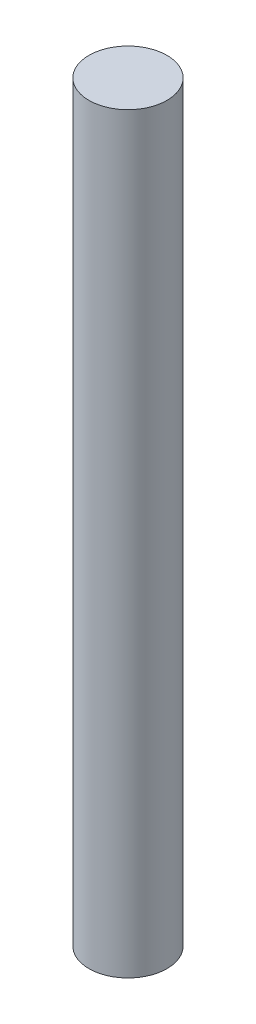
ISO-10303-21;
HEADER;
FILE_DESCRIPTION(('STEP AP214'),'2;1');
FILE_NAME('part.step','',(''),(''),'','','');
FILE_SCHEMA(('AUTOMOTIVE_DESIGN { 1 0 10303 214 1 1 1 1 }'));
ENDSEC;
DATA;
#1=APPLICATION_CONTEXT('core data for automotive mechanical design processes');
#2=APPLICATION_PROTOCOL_DEFINITION('international standard','automotive_design',2000,#1);
#3=PRODUCT_CONTEXT('',#1,'mechanical');
#4=PRODUCT('Part','Part','',(#3));
#5=PRODUCT_RELATED_PRODUCT_CATEGORY('part','',(#4));
#6=PRODUCT_DEFINITION_FORMATION('','',#4);
#7=PRODUCT_DEFINITION_CONTEXT('part definition',#1,'design');
#8=PRODUCT_DEFINITION('design','',#6,#7);
#9=PRODUCT_DEFINITION_SHAPE('','',#8);
#10=(LENGTH_UNIT() NAMED_UNIT(*) SI_UNIT(.MILLI.,.METRE.));
#11=(NAMED_UNIT(*) PLANE_ANGLE_UNIT() SI_UNIT($,.RADIAN.));
#12=(NAMED_UNIT(*) SI_UNIT($,.STERADIAN.) SOLID_ANGLE_UNIT());
#13=UNCERTAINTY_MEASURE_WITH_UNIT(LENGTH_MEASURE(1.E-05),#10,'distance_accuracy_value','');
#14=(GEOMETRIC_REPRESENTATION_CONTEXT(3) GLOBAL_UNCERTAINTY_ASSIGNED_CONTEXT((#13)) GLOBAL_UNIT_ASSIGNED_CONTEXT((#10,
#11,#12)) REPRESENTATION_CONTEXT('',''));
#15=CARTESIAN_POINT('',(0.,0.,0.));
#16=DIRECTION('',(0.,0.,1.));
#17=DIRECTION('',(1.,0.,0.));
#18=AXIS2_PLACEMENT_3D('',#15,#16,#17);
#19=CARTESIAN_POINT('',(0.,48.09,0.));
#20=DIRECTION('',(0.,-1.,0.));
#21=DIRECTION('',(0.,0.,-1.));
#22=AXIS2_PLACEMENT_3D('',#19,#20,#21);
#23=CYLINDRICAL_SURFACE('',#22,2.495);
#24=CARTESIAN_POINT('',(0.,4.845,0.));
#25=DIRECTION('',(0.,1.,0.));
#26=DIRECTION('',(0.,0.,1.));
#27=AXIS2_PLACEMENT_3D('',#24,#25,#26);
#28=CIRCLE('',#27,2.495);
#29=CARTESIAN_POINT('',(-1.645,4.845,-1.87589978410362));
#30=VERTEX_POINT('',#29);
#31=CARTESIAN_POINT('',(-1.64500000000001,4.845,1.87589978410362));
#32=VERTEX_POINT('',#31);
#33=EDGE_CURVE('E74',#30,#32,#28,.T.);
#34=ORIENTED_EDGE('',*,*,#33,.T.);
#35=DIRECTION('',(0.,-1.,0.));
#36=VECTOR('',#35,1.);
#37=CARTESIAN_POINT('',(-1.645,48.09,1.87589978410362));
#38=LINE('',#37,#36);
#39=CARTESIAN_POINT('',(-1.64500000000001,0.835000000000002,1.87589978410362));
#40=VERTEX_POINT('',#39);
#41=EDGE_CURVE('E11',#32,#40,#38,.T.);
#42=ORIENTED_EDGE('',*,*,#41,.T.);
#43=CARTESIAN_POINT('',(0.,0.835000000000002,0.));
#44=DIRECTION('',(0.,-1.,0.));
#45=DIRECTION('',(0.,0.,-1.));
#46=AXIS2_PLACEMENT_3D('',#43,#44,#45);
#47=CIRCLE('',#46,2.495);
#48=CARTESIAN_POINT('',(-1.64500000000001,0.835000000000002,-1.87589978410362));
#49=VERTEX_POINT('',#48);
#50=EDGE_CURVE('E41',#40,#49,#47,.T.);
#51=ORIENTED_EDGE('',*,*,#50,.T.);
#52=DIRECTION('',(0.,-1.,0.));
#53=VECTOR('',#52,1.);
#54=CARTESIAN_POINT('',(-1.645,48.09,-1.87589978410362));
#55=LINE('',#54,#53);
#56=EDGE_CURVE('E77',#49,#30,#55,.F.);
#57=ORIENTED_EDGE('',*,*,#56,.T.);
#58=EDGE_LOOP('',(#34,#42,#51,#57));
#59=FACE_BOUND('',#58,.T.);
#60=DIRECTION('',(0.,-1.,0.));
#61=VECTOR('',#60,1.);
#62=CARTESIAN_POINT('',(-1.64500000000001,48.09,-1.87589978410361));
#63=LINE('',#62,#61);
#64=CARTESIAN_POINT('',(-1.64500000000001,43.245,-1.87589978410361));
#65=VERTEX_POINT('',#64);
#66=CARTESIAN_POINT('',(-1.64500000000001,47.255,-1.87589978410361));
#67=VERTEX_POINT('',#66);
#68=EDGE_CURVE('E101',#65,#67,#63,.F.);
#69=ORIENTED_EDGE('',*,*,#68,.T.);
#70=CARTESIAN_POINT('',(0.,47.255,0.));
#71=DIRECTION('',(0.,1.,0.));
#72=DIRECTION('',(0.,0.,1.));
#73=AXIS2_PLACEMENT_3D('',#70,#71,#72);
#74=CIRCLE('',#73,2.495);
#75=CARTESIAN_POINT('',(-1.64500000000001,47.255,1.87589978410361));
#76=VERTEX_POINT('',#75);
#77=EDGE_CURVE('E107',#67,#76,#74,.T.);
#78=ORIENTED_EDGE('',*,*,#77,.T.);
#79=DIRECTION('',(0.,-1.,0.));
#80=VECTOR('',#79,1.);
#81=CARTESIAN_POINT('',(-1.64500000000001,48.09,1.87589978410361));
#82=LINE('',#81,#80);
#83=CARTESIAN_POINT('',(-1.64500000000001,43.245,1.87589978410361));
#84=VERTEX_POINT('',#83);
#85=EDGE_CURVE('E104',#76,#84,#82,.T.);
#86=ORIENTED_EDGE('',*,*,#85,.T.);
#87=CARTESIAN_POINT('',(0.,43.245,0.));
#88=DIRECTION('',(0.,-1.,0.));
#89=DIRECTION('',(0.,0.,-1.));
#90=AXIS2_PLACEMENT_3D('',#87,#88,#89);
#91=CIRCLE('',#90,2.495);
#92=EDGE_CURVE('E96',#84,#65,#91,.T.);
#93=ORIENTED_EDGE('',*,*,#92,.T.);
#94=EDGE_LOOP('',(#69,#78,#86,#93));
#95=FACE_BOUND('',#94,.T.);
#96=CARTESIAN_POINT('',(0.,48.09,0.));
#97=DIRECTION('',(0.,1.,0.));
#98=DIRECTION('',(0.,0.,1.));
#99=AXIS2_PLACEMENT_3D('',#96,#97,#98);
#100=CIRCLE('',#99,2.495);
#101=CARTESIAN_POINT('',(0.,48.09,2.495));
#102=VERTEX_POINT('',#101);
#103=EDGE_CURVE('E93',#102,#102,#100,.T.);
#104=ORIENTED_EDGE('',*,*,#103,.F.);
#105=EDGE_LOOP('',(#104));
#106=FACE_BOUND('',#105,.T.);
#107=CARTESIAN_POINT('',(0.,0.,0.));
#108=DIRECTION('',(0.,1.,0.));
#109=DIRECTION('',(0.,0.,1.));
#110=AXIS2_PLACEMENT_3D('',#107,#108,#109);
#111=CIRCLE('',#110,2.495);
#112=CARTESIAN_POINT('',(0.,0.,2.495));
#113=VERTEX_POINT('',#112);
#114=EDGE_CURVE('E91',#113,#113,#111,.T.);
#115=ORIENTED_EDGE('',*,*,#114,.T.);
#116=EDGE_LOOP('',(#115));
#117=FACE_BOUND('',#116,.T.);
#118=ADVANCED_FACE('F34',(#59,#95,#106,#117),#23,.T.);
#119=CARTESIAN_POINT('',(0.,48.09,0.));
#120=DIRECTION('',(0.,1.,0.));
#121=DIRECTION('',(0.,0.,1.));
#122=AXIS2_PLACEMENT_3D('',#119,#120,#121);
#123=PLANE('',#122);
#124=ORIENTED_EDGE('',*,*,#103,.T.);
#125=EDGE_LOOP('',(#124));
#126=FACE_BOUND('',#125,.T.);
#127=ADVANCED_FACE('F125',(#126),#123,.T.);
#128=CARTESIAN_POINT('',(0.,0.,0.));
#129=DIRECTION('',(0.,1.,0.));
#130=DIRECTION('',(0.,0.,1.));
#131=AXIS2_PLACEMENT_3D('',#128,#129,#130);
#132=PLANE('',#131);
#133=ORIENTED_EDGE('',*,*,#114,.F.);
#134=EDGE_LOOP('',(#133));
#135=FACE_BOUND('',#134,.T.);
#136=ADVANCED_FACE('F129',(#135),#132,.F.);
#137=CARTESIAN_POINT('',(-2.49500000000001,47.255,-2.495));
#138=DIRECTION('',(0.,1.,0.));
#139=DIRECTION('',(0.,0.,1.));
#140=AXIS2_PLACEMENT_3D('',#137,#138,#139);
#141=PLANE('',#140);
#142=DIRECTION('',(0.,0.,1.));
#143=VECTOR('',#142,1.);
#144=CARTESIAN_POINT('',(-1.64500000000001,47.255,-2.495));
#145=LINE('',#144,#143);
#146=EDGE_CURVE('E86',#67,#76,#145,.T.);
#147=ORIENTED_EDGE('',*,*,#146,.T.);
#148=ORIENTED_EDGE('',*,*,#77,.F.);
#149=EDGE_LOOP('',(#147,#148));
#150=FACE_BOUND('',#149,.T.);
#151=ADVANCED_FACE('F135',(#150),#141,.F.);
#152=CARTESIAN_POINT('',(-1.64500000000001,47.255,-2.495));
#153=DIRECTION('',(1.,0.,0.));
#154=DIRECTION('',(0.,1.,0.));
#155=AXIS2_PLACEMENT_3D('',#152,#153,#154);
#156=PLANE('',#155);
#157=ORIENTED_EDGE('',*,*,#146,.F.);
#158=ORIENTED_EDGE('',*,*,#68,.F.);
#159=DIRECTION('',(0.,0.,1.));
#160=VECTOR('',#159,1.);
#161=CARTESIAN_POINT('',(-1.64500000000001,43.245,-2.495));
#162=LINE('',#161,#160);
#163=EDGE_CURVE('E55',#65,#84,#162,.T.);
#164=ORIENTED_EDGE('',*,*,#163,.T.);
#165=ORIENTED_EDGE('',*,*,#85,.F.);
#166=EDGE_LOOP('',(#157,#158,#164,#165));
#167=FACE_BOUND('',#166,.T.);
#168=ADVANCED_FACE('F120',(#167),#156,.F.);
#169=CARTESIAN_POINT('',(-2.49500000000001,43.245,-2.495));
#170=DIRECTION('',(0.,-1.,0.));
#171=DIRECTION('',(0.,0.,-1.));
#172=AXIS2_PLACEMENT_3D('',#169,#170,#171);
#173=PLANE('',#172);
#174=ORIENTED_EDGE('',*,*,#163,.F.);
#175=ORIENTED_EDGE('',*,*,#92,.F.);
#176=EDGE_LOOP('',(#174,#175));
#177=FACE_BOUND('',#176,.T.);
#178=ADVANCED_FACE('F113',(#177),#173,.F.);
#179=CARTESIAN_POINT('',(-2.49500000000001,0.835000000000002,-2.495));
#180=DIRECTION('',(0.,-1.,0.));
#181=DIRECTION('',(0.,0.,-1.));
#182=AXIS2_PLACEMENT_3D('',#179,#180,#181);
#183=PLANE('',#182);
#184=DIRECTION('',(0.,0.,1.));
#185=VECTOR('',#184,1.);
#186=CARTESIAN_POINT('',(-1.64500000000001,0.835000000000002,-2.495));
#187=LINE('',#186,#185);
#188=EDGE_CURVE('E83',#49,#40,#187,.T.);
#189=ORIENTED_EDGE('',*,*,#188,.F.);
#190=ORIENTED_EDGE('',*,*,#50,.F.);
#191=EDGE_LOOP('',(#189,#190));
#192=FACE_BOUND('',#191,.T.);
#193=ADVANCED_FACE('F111',(#192),#183,.F.);
#194=CARTESIAN_POINT('',(-2.49500000000001,4.845,-2.495));
#195=DIRECTION('',(0.,1.,0.));
#196=DIRECTION('',(0.,0.,1.));
#197=AXIS2_PLACEMENT_3D('',#194,#195,#196);
#198=PLANE('',#197);
#199=DIRECTION('',(0.,0.,1.));
#200=VECTOR('',#199,1.);
#201=CARTESIAN_POINT('',(-1.64500000000001,4.845,-2.495));
#202=LINE('',#201,#200);
#203=EDGE_CURVE('E48',#30,#32,#202,.T.);
#204=ORIENTED_EDGE('',*,*,#203,.T.);
#205=ORIENTED_EDGE('',*,*,#33,.F.);
#206=EDGE_LOOP('',(#204,#205));
#207=FACE_BOUND('',#206,.T.);
#208=ADVANCED_FACE('F84',(#207),#198,.F.);
#209=CARTESIAN_POINT('',(-1.64500000000001,0.835000000000002,-2.495));
#210=DIRECTION('',(1.,0.,0.));
#211=DIRECTION('',(0.,1.,0.));
#212=AXIS2_PLACEMENT_3D('',#209,#210,#211);
#213=PLANE('',#212);
#214=ORIENTED_EDGE('',*,*,#203,.F.);
#215=ORIENTED_EDGE('',*,*,#56,.F.);
#216=ORIENTED_EDGE('',*,*,#188,.T.);
#217=ORIENTED_EDGE('',*,*,#41,.F.);
#218=EDGE_LOOP('',(#214,#215,#216,#217));
#219=FACE_BOUND('',#218,.T.);
#220=ADVANCED_FACE('F81',(#219),#213,.F.);
#221=CLOSED_SHELL('',(#118,#127,#136,#151,#168,#178,#193,#208,#220));
#222=MANIFOLD_SOLID_BREP('B2',#221);
#223=ADVANCED_BREP_SHAPE_REPRESENTATION('',(#18,#222),#14);
#224=SHAPE_DEFINITION_REPRESENTATION(#9,#223);
ENDSEC;
END-ISO-10303-21;
